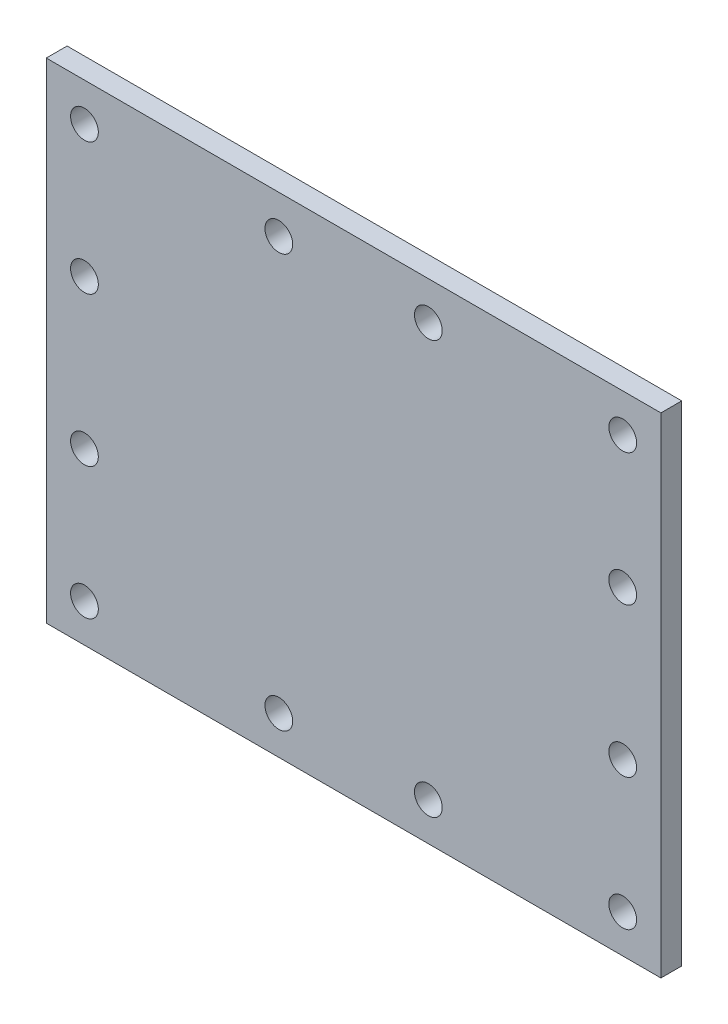
ISO-10303-21;
HEADER;
FILE_DESCRIPTION(('STEP AP214'),'2;1');
FILE_NAME('part.step','',(''),(''),'','','');
FILE_SCHEMA(('AUTOMOTIVE_DESIGN { 1 0 10303 214 1 1 1 1 }'));
ENDSEC;
DATA;
#1=APPLICATION_CONTEXT('core data for automotive mechanical design processes');
#2=APPLICATION_PROTOCOL_DEFINITION('international standard','automotive_design',2000,#1);
#3=PRODUCT_CONTEXT('',#1,'mechanical');
#4=PRODUCT('Part','Part','',(#3));
#5=PRODUCT_RELATED_PRODUCT_CATEGORY('part','',(#4));
#6=PRODUCT_DEFINITION_FORMATION('','',#4);
#7=PRODUCT_DEFINITION_CONTEXT('part definition',#1,'design');
#8=PRODUCT_DEFINITION('design','',#6,#7);
#9=PRODUCT_DEFINITION_SHAPE('','',#8);
#10=(LENGTH_UNIT() NAMED_UNIT(*) SI_UNIT(.MILLI.,.METRE.));
#11=(NAMED_UNIT(*) PLANE_ANGLE_UNIT() SI_UNIT($,.RADIAN.));
#12=(NAMED_UNIT(*) SI_UNIT($,.STERADIAN.) SOLID_ANGLE_UNIT());
#13=UNCERTAINTY_MEASURE_WITH_UNIT(LENGTH_MEASURE(1.E-05),#10,'distance_accuracy_value','');
#14=(GEOMETRIC_REPRESENTATION_CONTEXT(3) GLOBAL_UNCERTAINTY_ASSIGNED_CONTEXT((#13)) GLOBAL_UNIT_ASSIGNED_CONTEXT((#10,
#11,#12)) REPRESENTATION_CONTEXT('',''));
#15=CARTESIAN_POINT('',(0.,0.,0.));
#16=DIRECTION('',(0.,0.,1.));
#17=DIRECTION('',(1.,0.,0.));
#18=AXIS2_PLACEMENT_3D('',#15,#16,#17);
#19=CARTESIAN_POINT('',(-146.164312824647,106.241954424767,-2.51040500289528));
#20=DIRECTION('',(0.,1.,0.));
#21=DIRECTION('',(-1.,0.,0.));
#22=AXIS2_PLACEMENT_3D('',#19,#20,#21);
#23=PLANE('',#22);
#24=DIRECTION('',(1.,0.,0.));
#25=VECTOR('',#24,1.);
#26=CARTESIAN_POINT('',(-146.164312824647,106.241954424767,-5.51040500289528));
#27=LINE('',#26,#25);
#28=CARTESIAN_POINT('',(-146.164312824647,106.241954424767,-5.51040500289528));
#29=VERTEX_POINT('',#28);
#30=CARTESIAN_POINT('',(-57.6243128246472,106.241954424767,-5.51040500289528));
#31=VERTEX_POINT('',#30);
#32=EDGE_CURVE('E98',#29,#31,#27,.T.);
#33=ORIENTED_EDGE('',*,*,#32,.F.);
#34=DIRECTION('',(0.,0.,-1.));
#35=VECTOR('',#34,1.);
#36=CARTESIAN_POINT('',(-146.164312824647,106.241954424767,-2.51040500289528));
#37=LINE('',#36,#35);
#38=CARTESIAN_POINT('',(-146.164312824647,106.241954424767,-2.51040500289528));
#39=VERTEX_POINT('',#38);
#40=EDGE_CURVE('E11',#39,#29,#37,.T.);
#41=ORIENTED_EDGE('',*,*,#40,.F.);
#42=DIRECTION('',(1.,0.,0.));
#43=VECTOR('',#42,1.);
#44=CARTESIAN_POINT('',(-146.164312824647,106.241954424767,-2.51040500289528));
#45=LINE('',#44,#43);
#46=CARTESIAN_POINT('',(-57.6243128246472,106.241954424767,-2.51040500289528));
#47=VERTEX_POINT('',#46);
#48=EDGE_CURVE('E91',#39,#47,#45,.T.);
#49=ORIENTED_EDGE('',*,*,#48,.T.);
#50=DIRECTION('',(0.,0.,-1.));
#51=VECTOR('',#50,1.);
#52=CARTESIAN_POINT('',(-57.6243128246472,106.241954424767,-2.51040500289528));
#53=LINE('',#52,#51);
#54=EDGE_CURVE('E36',#47,#31,#53,.T.);
#55=ORIENTED_EDGE('',*,*,#54,.T.);
#56=EDGE_LOOP('',(#33,#41,#49,#55));
#57=FACE_BOUND('',#56,.T.);
#58=ADVANCED_FACE('F33',(#57),#23,.T.);
#59=CARTESIAN_POINT('',(-146.164312824647,35.7443544247679,-2.51040500289528));
#60=DIRECTION('',(-1.,0.,0.));
#61=DIRECTION('',(0.,0.,1.));
#62=AXIS2_PLACEMENT_3D('',#59,#60,#61);
#63=PLANE('',#62);
#64=DIRECTION('',(0.,1.,0.));
#65=VECTOR('',#64,1.);
#66=CARTESIAN_POINT('',(-146.164312824647,35.7443544247679,-5.51040500289528));
#67=LINE('',#66,#65);
#68=CARTESIAN_POINT('',(-146.164312824647,35.7443544247679,-5.51040500289528));
#69=VERTEX_POINT('',#68);
#70=EDGE_CURVE('E93',#69,#29,#67,.T.);
#71=ORIENTED_EDGE('',*,*,#70,.F.);
#72=DIRECTION('',(0.,0.,-1.));
#73=VECTOR('',#72,1.);
#74=CARTESIAN_POINT('',(-146.164312824647,35.7443544247679,-2.51040500289528));
#75=LINE('',#74,#73);
#76=CARTESIAN_POINT('',(-146.164312824647,35.7443544247679,-2.51040500289528));
#77=VERTEX_POINT('',#76);
#78=EDGE_CURVE('E42',#77,#69,#75,.T.);
#79=ORIENTED_EDGE('',*,*,#78,.F.);
#80=DIRECTION('',(0.,1.,0.));
#81=VECTOR('',#80,1.);
#82=CARTESIAN_POINT('',(-146.164312824647,35.7443544247679,-2.51040500289528));
#83=LINE('',#82,#81);
#84=EDGE_CURVE('E88',#77,#39,#83,.T.);
#85=ORIENTED_EDGE('',*,*,#84,.T.);
#86=ORIENTED_EDGE('',*,*,#40,.T.);
#87=EDGE_LOOP('',(#71,#79,#85,#86));
#88=FACE_BOUND('',#87,.T.);
#89=ADVANCED_FACE('F109',(#88),#63,.T.);
#90=CARTESIAN_POINT('',(-57.6243128246472,35.7443544247679,-2.51040500289528));
#91=DIRECTION('',(0.,-1.,0.));
#92=DIRECTION('',(1.,0.,0.));
#93=AXIS2_PLACEMENT_3D('',#90,#91,#92);
#94=PLANE('',#93);
#95=DIRECTION('',(-1.,0.,0.));
#96=VECTOR('',#95,1.);
#97=CARTESIAN_POINT('',(-57.6243128246472,35.7443544247679,-5.51040500289528));
#98=LINE('',#97,#96);
#99=CARTESIAN_POINT('',(-57.6243128246472,35.7443544247679,-5.51040500289528));
#100=VERTEX_POINT('',#99);
#101=EDGE_CURVE('E83',#100,#69,#98,.T.);
#102=ORIENTED_EDGE('',*,*,#101,.F.);
#103=DIRECTION('',(0.,0.,-1.));
#104=VECTOR('',#103,1.);
#105=CARTESIAN_POINT('',(-57.6243128246472,35.7443544247679,-2.51040500289528));
#106=LINE('',#105,#104);
#107=CARTESIAN_POINT('',(-57.6243128246472,35.7443544247679,-2.51040500289528));
#108=VERTEX_POINT('',#107);
#109=EDGE_CURVE('E78',#108,#100,#106,.T.);
#110=ORIENTED_EDGE('',*,*,#109,.F.);
#111=DIRECTION('',(-1.,0.,0.));
#112=VECTOR('',#111,1.);
#113=CARTESIAN_POINT('',(-57.6243128246472,35.7443544247679,-2.51040500289528));
#114=LINE('',#113,#112);
#115=EDGE_CURVE('E81',#108,#77,#114,.T.);
#116=ORIENTED_EDGE('',*,*,#115,.T.);
#117=ORIENTED_EDGE('',*,*,#78,.T.);
#118=EDGE_LOOP('',(#102,#110,#116,#117));
#119=FACE_BOUND('',#118,.T.);
#120=ADVANCED_FACE('F80',(#119),#94,.T.);
#121=CARTESIAN_POINT('',(-57.6243128246472,106.241954424767,-2.51040500289528));
#122=DIRECTION('',(1.,0.,0.));
#123=DIRECTION('',(0.,1.,0.));
#124=AXIS2_PLACEMENT_3D('',#121,#122,#123);
#125=PLANE('',#124);
#126=DIRECTION('',(0.,-1.,0.));
#127=VECTOR('',#126,1.);
#128=CARTESIAN_POINT('',(-57.6243128246472,106.241954424767,-5.51040500289528));
#129=LINE('',#128,#127);
#130=EDGE_CURVE('E101',#31,#100,#129,.T.);
#131=ORIENTED_EDGE('',*,*,#130,.F.);
#132=ORIENTED_EDGE('',*,*,#54,.F.);
#133=DIRECTION('',(0.,-1.,0.));
#134=VECTOR('',#133,1.);
#135=CARTESIAN_POINT('',(-57.6243128246472,106.241954424767,-2.51040500289528));
#136=LINE('',#135,#134);
#137=EDGE_CURVE('E87',#47,#108,#136,.T.);
#138=ORIENTED_EDGE('',*,*,#137,.T.);
#139=ORIENTED_EDGE('',*,*,#109,.T.);
#140=EDGE_LOOP('',(#131,#132,#138,#139));
#141=FACE_BOUND('',#140,.T.);
#142=ADVANCED_FACE('F90',(#141),#125,.T.);
#143=CARTESIAN_POINT('',(0.,0.,-2.51040500289528));
#144=DIRECTION('',(0.,0.,-1.));
#145=DIRECTION('',(-1.,0.,0.));
#146=AXIS2_PLACEMENT_3D('',#143,#144,#145);
#147=PLANE('',#146);
#148=CARTESIAN_POINT('',(-112.664312824647,100.741954424767,-2.51040500289528));
#149=DIRECTION('',(0.,0.,-1.));
#150=DIRECTION('',(-1.,0.,0.));
#151=AXIS2_PLACEMENT_3D('',#148,#149,#150);
#152=CIRCLE('',#151,2.);
#153=CARTESIAN_POINT('',(-114.664312824647,100.741954424767,-2.51040500289528));
#154=VERTEX_POINT('',#153);
#155=EDGE_CURVE('E182',#154,#154,#152,.T.);
#156=ORIENTED_EDGE('',*,*,#155,.T.);
#157=EDGE_LOOP('',(#156));
#158=FACE_BOUND('',#157,.T.);
#159=CARTESIAN_POINT('',(-91.1243128246472,100.741954424767,-2.51040500289528));
#160=DIRECTION('',(0.,0.,-1.));
#161=DIRECTION('',(-1.,0.,0.));
#162=AXIS2_PLACEMENT_3D('',#159,#160,#161);
#163=CIRCLE('',#162,2.);
#164=CARTESIAN_POINT('',(-93.1243128246472,100.741954424767,-2.51040500289528));
#165=VERTEX_POINT('',#164);
#166=EDGE_CURVE('E190',#165,#165,#163,.T.);
#167=ORIENTED_EDGE('',*,*,#166,.T.);
#168=EDGE_LOOP('',(#167));
#169=FACE_BOUND('',#168,.T.);
#170=CARTESIAN_POINT('',(-63.1243128246472,100.741954424767,-2.51040500289528));
#171=DIRECTION('',(0.,0.,-1.));
#172=DIRECTION('',(-1.,0.,0.));
#173=AXIS2_PLACEMENT_3D('',#170,#171,#172);
#174=CIRCLE('',#173,1.99999999999998);
#175=CARTESIAN_POINT('',(-65.1243128246472,100.741954424767,-2.51040500289528));
#176=VERTEX_POINT('',#175);
#177=EDGE_CURVE('E196',#176,#176,#174,.T.);
#178=ORIENTED_EDGE('',*,*,#177,.T.);
#179=EDGE_LOOP('',(#178));
#180=FACE_BOUND('',#179,.T.);
#181=CARTESIAN_POINT('',(-63.1243128246471,81.7419544247674,-2.51040500289528));
#182=DIRECTION('',(0.,0.,-1.));
#183=DIRECTION('',(-1.,0.,0.));
#184=AXIS2_PLACEMENT_3D('',#181,#182,#183);
#185=CIRCLE('',#184,1.99999999999998);
#186=CARTESIAN_POINT('',(-65.1243128246471,81.7419544247674,-2.51040500289528));
#187=VERTEX_POINT('',#186);
#188=EDGE_CURVE('E202',#187,#187,#185,.T.);
#189=ORIENTED_EDGE('',*,*,#188,.T.);
#190=EDGE_LOOP('',(#189));
#191=FACE_BOUND('',#190,.T.);
#192=CARTESIAN_POINT('',(-63.1243128246471,60.2443544247679,-2.51040500289528));
#193=DIRECTION('',(0.,0.,-1.));
#194=DIRECTION('',(-1.,0.,0.));
#195=AXIS2_PLACEMENT_3D('',#192,#193,#194);
#196=CIRCLE('',#195,1.99999999999998);
#197=CARTESIAN_POINT('',(-65.1243128246471,60.2443544247679,-2.51040500289528));
#198=VERTEX_POINT('',#197);
#199=EDGE_CURVE('E208',#198,#198,#196,.T.);
#200=ORIENTED_EDGE('',*,*,#199,.T.);
#201=EDGE_LOOP('',(#200));
#202=FACE_BOUND('',#201,.T.);
#203=CARTESIAN_POINT('',(-63.1243128246472,41.2443544247679,-2.51040500289528));
#204=DIRECTION('',(0.,0.,-1.));
#205=DIRECTION('',(-1.,0.,0.));
#206=AXIS2_PLACEMENT_3D('',#203,#204,#205);
#207=CIRCLE('',#206,1.99999999999998);
#208=CARTESIAN_POINT('',(-65.1243128246472,41.2443544247679,-2.51040500289528));
#209=VERTEX_POINT('',#208);
#210=EDGE_CURVE('E214',#209,#209,#207,.T.);
#211=ORIENTED_EDGE('',*,*,#210,.T.);
#212=EDGE_LOOP('',(#211));
#213=FACE_BOUND('',#212,.T.);
#214=CARTESIAN_POINT('',(-91.1243128246472,41.2443544247679,-2.51040500289528));
#215=DIRECTION('',(0.,0.,-1.));
#216=DIRECTION('',(-1.,0.,0.));
#217=AXIS2_PLACEMENT_3D('',#214,#215,#216);
#218=CIRCLE('',#217,2.);
#219=CARTESIAN_POINT('',(-93.1243128246472,41.2443544247679,-2.51040500289528));
#220=VERTEX_POINT('',#219);
#221=EDGE_CURVE('E220',#220,#220,#218,.T.);
#222=ORIENTED_EDGE('',*,*,#221,.T.);
#223=EDGE_LOOP('',(#222));
#224=FACE_BOUND('',#223,.T.);
#225=CARTESIAN_POINT('',(-112.664312824647,41.2443544247679,-2.51040500289528));
#226=DIRECTION('',(0.,0.,-1.));
#227=DIRECTION('',(-1.,0.,0.));
#228=AXIS2_PLACEMENT_3D('',#225,#226,#227);
#229=CIRCLE('',#228,2.);
#230=CARTESIAN_POINT('',(-114.664312824647,41.2443544247679,-2.51040500289528));
#231=VERTEX_POINT('',#230);
#232=EDGE_CURVE('E226',#231,#231,#229,.T.);
#233=ORIENTED_EDGE('',*,*,#232,.T.);
#234=EDGE_LOOP('',(#233));
#235=FACE_BOUND('',#234,.T.);
#236=CARTESIAN_POINT('',(-140.664312824647,41.2443544247679,-2.51040500289528));
#237=DIRECTION('',(0.,0.,-1.));
#238=DIRECTION('',(-1.,0.,0.));
#239=AXIS2_PLACEMENT_3D('',#236,#237,#238);
#240=CIRCLE('',#239,2.);
#241=CARTESIAN_POINT('',(-142.664312824647,41.2443544247679,-2.51040500289528));
#242=VERTEX_POINT('',#241);
#243=EDGE_CURVE('E232',#242,#242,#240,.T.);
#244=ORIENTED_EDGE('',*,*,#243,.T.);
#245=EDGE_LOOP('',(#244));
#246=FACE_BOUND('',#245,.T.);
#247=CARTESIAN_POINT('',(-140.664312824647,60.2443544247679,-2.51040500289528));
#248=DIRECTION('',(0.,0.,-1.));
#249=DIRECTION('',(-1.,0.,0.));
#250=AXIS2_PLACEMENT_3D('',#247,#248,#249);
#251=CIRCLE('',#250,2.);
#252=CARTESIAN_POINT('',(-142.664312824647,60.2443544247679,-2.51040500289528));
#253=VERTEX_POINT('',#252);
#254=EDGE_CURVE('E238',#253,#253,#251,.T.);
#255=ORIENTED_EDGE('',*,*,#254,.T.);
#256=EDGE_LOOP('',(#255));
#257=FACE_BOUND('',#256,.T.);
#258=CARTESIAN_POINT('',(-140.664312824647,100.741954424767,-2.51040500289528));
#259=DIRECTION('',(0.,0.,-1.));
#260=DIRECTION('',(-1.,0.,0.));
#261=AXIS2_PLACEMENT_3D('',#258,#259,#260);
#262=CIRCLE('',#261,2.);
#263=CARTESIAN_POINT('',(-142.664312824647,100.741954424767,-2.51040500289528));
#264=VERTEX_POINT('',#263);
#265=EDGE_CURVE('E244',#264,#264,#262,.T.);
#266=ORIENTED_EDGE('',*,*,#265,.T.);
#267=EDGE_LOOP('',(#266));
#268=FACE_BOUND('',#267,.T.);
#269=CARTESIAN_POINT('',(-140.664312824647,81.7419544247674,-2.51040500289528));
#270=DIRECTION('',(0.,0.,-1.));
#271=DIRECTION('',(-1.,0.,0.));
#272=AXIS2_PLACEMENT_3D('',#269,#270,#271);
#273=CIRCLE('',#272,2.);
#274=CARTESIAN_POINT('',(-142.664312824647,81.7419544247674,-2.51040500289528));
#275=VERTEX_POINT('',#274);
#276=EDGE_CURVE('E102',#275,#275,#273,.T.);
#277=ORIENTED_EDGE('',*,*,#276,.T.);
#278=EDGE_LOOP('',(#277));
#279=FACE_BOUND('',#278,.T.);
#280=ORIENTED_EDGE('',*,*,#48,.F.);
#281=ORIENTED_EDGE('',*,*,#84,.F.);
#282=ORIENTED_EDGE('',*,*,#115,.F.);
#283=ORIENTED_EDGE('',*,*,#137,.F.);
#284=EDGE_LOOP('',(#280,#281,#282,#283));
#285=FACE_BOUND('',#284,.T.);
#286=ADVANCED_FACE('F86',(#158,#169,#180,#191,#202,#213,#224,#235,#246,#257,#268,#279,#285),
#147,.F.);
#287=CARTESIAN_POINT('',(0.,0.,-5.51040500289528));
#288=DIRECTION('',(0.,0.,-1.));
#289=DIRECTION('',(-1.,0.,0.));
#290=AXIS2_PLACEMENT_3D('',#287,#288,#289);
#291=PLANE('',#290);
#292=CARTESIAN_POINT('',(-112.664312824647,100.741954424767,-5.51040500289528));
#293=DIRECTION('',(0.,0.,-1.));
#294=DIRECTION('',(-1.,0.,0.));
#295=AXIS2_PLACEMENT_3D('',#292,#293,#294);
#296=CIRCLE('',#295,2.);
#297=CARTESIAN_POINT('',(-114.664312824647,100.741954424767,-5.51040500289528));
#298=VERTEX_POINT('',#297);
#299=EDGE_CURVE('E185',#298,#298,#296,.T.);
#300=ORIENTED_EDGE('',*,*,#299,.F.);
#301=EDGE_LOOP('',(#300));
#302=FACE_BOUND('',#301,.T.);
#303=CARTESIAN_POINT('',(-91.1243128246472,100.741954424767,-5.51040500289528));
#304=DIRECTION('',(0.,0.,-1.));
#305=DIRECTION('',(-1.,0.,0.));
#306=AXIS2_PLACEMENT_3D('',#303,#304,#305);
#307=CIRCLE('',#306,2.);
#308=CARTESIAN_POINT('',(-93.1243128246472,100.741954424767,-5.51040500289528));
#309=VERTEX_POINT('',#308);
#310=EDGE_CURVE('E187',#309,#309,#307,.T.);
#311=ORIENTED_EDGE('',*,*,#310,.F.);
#312=EDGE_LOOP('',(#311));
#313=FACE_BOUND('',#312,.T.);
#314=CARTESIAN_POINT('',(-63.1243128246472,100.741954424767,-5.51040500289528));
#315=DIRECTION('',(0.,0.,-1.));
#316=DIRECTION('',(-1.,0.,0.));
#317=AXIS2_PLACEMENT_3D('',#314,#315,#316);
#318=CIRCLE('',#317,1.99999999999998);
#319=CARTESIAN_POINT('',(-65.1243128246472,100.741954424767,-5.51040500289528));
#320=VERTEX_POINT('',#319);
#321=EDGE_CURVE('E193',#320,#320,#318,.T.);
#322=ORIENTED_EDGE('',*,*,#321,.F.);
#323=EDGE_LOOP('',(#322));
#324=FACE_BOUND('',#323,.T.);
#325=CARTESIAN_POINT('',(-63.1243128246471,81.7419544247674,-5.51040500289528));
#326=DIRECTION('',(0.,0.,-1.));
#327=DIRECTION('',(-1.,0.,0.));
#328=AXIS2_PLACEMENT_3D('',#325,#326,#327);
#329=CIRCLE('',#328,1.99999999999998);
#330=CARTESIAN_POINT('',(-65.1243128246471,81.7419544247674,-5.51040500289528));
#331=VERTEX_POINT('',#330);
#332=EDGE_CURVE('E199',#331,#331,#329,.T.);
#333=ORIENTED_EDGE('',*,*,#332,.F.);
#334=EDGE_LOOP('',(#333));
#335=FACE_BOUND('',#334,.T.);
#336=CARTESIAN_POINT('',(-63.1243128246471,60.2443544247679,-5.51040500289528));
#337=DIRECTION('',(0.,0.,-1.));
#338=DIRECTION('',(-1.,0.,0.));
#339=AXIS2_PLACEMENT_3D('',#336,#337,#338);
#340=CIRCLE('',#339,1.99999999999998);
#341=CARTESIAN_POINT('',(-65.1243128246471,60.2443544247679,-5.51040500289528));
#342=VERTEX_POINT('',#341);
#343=EDGE_CURVE('E205',#342,#342,#340,.T.);
#344=ORIENTED_EDGE('',*,*,#343,.F.);
#345=EDGE_LOOP('',(#344));
#346=FACE_BOUND('',#345,.T.);
#347=CARTESIAN_POINT('',(-63.1243128246472,41.2443544247679,-5.51040500289528));
#348=DIRECTION('',(0.,0.,-1.));
#349=DIRECTION('',(-1.,0.,0.));
#350=AXIS2_PLACEMENT_3D('',#347,#348,#349);
#351=CIRCLE('',#350,1.99999999999998);
#352=CARTESIAN_POINT('',(-65.1243128246472,41.2443544247679,-5.51040500289528));
#353=VERTEX_POINT('',#352);
#354=EDGE_CURVE('E211',#353,#353,#351,.T.);
#355=ORIENTED_EDGE('',*,*,#354,.F.);
#356=EDGE_LOOP('',(#355));
#357=FACE_BOUND('',#356,.T.);
#358=CARTESIAN_POINT('',(-91.1243128246472,41.2443544247679,-5.51040500289528));
#359=DIRECTION('',(0.,0.,-1.));
#360=DIRECTION('',(-1.,0.,0.));
#361=AXIS2_PLACEMENT_3D('',#358,#359,#360);
#362=CIRCLE('',#361,2.);
#363=CARTESIAN_POINT('',(-93.1243128246472,41.2443544247679,-5.51040500289528));
#364=VERTEX_POINT('',#363);
#365=EDGE_CURVE('E217',#364,#364,#362,.T.);
#366=ORIENTED_EDGE('',*,*,#365,.F.);
#367=EDGE_LOOP('',(#366));
#368=FACE_BOUND('',#367,.T.);
#369=CARTESIAN_POINT('',(-112.664312824647,41.2443544247679,-5.51040500289528));
#370=DIRECTION('',(0.,0.,-1.));
#371=DIRECTION('',(-1.,0.,0.));
#372=AXIS2_PLACEMENT_3D('',#369,#370,#371);
#373=CIRCLE('',#372,2.);
#374=CARTESIAN_POINT('',(-114.664312824647,41.2443544247679,-5.51040500289528));
#375=VERTEX_POINT('',#374);
#376=EDGE_CURVE('E223',#375,#375,#373,.T.);
#377=ORIENTED_EDGE('',*,*,#376,.F.);
#378=EDGE_LOOP('',(#377));
#379=FACE_BOUND('',#378,.T.);
#380=CARTESIAN_POINT('',(-140.664312824647,41.2443544247679,-5.51040500289528));
#381=DIRECTION('',(0.,0.,-1.));
#382=DIRECTION('',(-1.,0.,0.));
#383=AXIS2_PLACEMENT_3D('',#380,#381,#382);
#384=CIRCLE('',#383,2.);
#385=CARTESIAN_POINT('',(-142.664312824647,41.2443544247679,-5.51040500289528));
#386=VERTEX_POINT('',#385);
#387=EDGE_CURVE('E229',#386,#386,#384,.T.);
#388=ORIENTED_EDGE('',*,*,#387,.F.);
#389=EDGE_LOOP('',(#388));
#390=FACE_BOUND('',#389,.T.);
#391=CARTESIAN_POINT('',(-140.664312824647,60.2443544247679,-5.51040500289528));
#392=DIRECTION('',(0.,0.,-1.));
#393=DIRECTION('',(-1.,0.,0.));
#394=AXIS2_PLACEMENT_3D('',#391,#392,#393);
#395=CIRCLE('',#394,2.);
#396=CARTESIAN_POINT('',(-142.664312824647,60.2443544247679,-5.51040500289528));
#397=VERTEX_POINT('',#396);
#398=EDGE_CURVE('E235',#397,#397,#395,.T.);
#399=ORIENTED_EDGE('',*,*,#398,.F.);
#400=EDGE_LOOP('',(#399));
#401=FACE_BOUND('',#400,.T.);
#402=CARTESIAN_POINT('',(-140.664312824647,100.741954424767,-5.51040500289528));
#403=DIRECTION('',(0.,0.,-1.));
#404=DIRECTION('',(-1.,0.,0.));
#405=AXIS2_PLACEMENT_3D('',#402,#403,#404);
#406=CIRCLE('',#405,2.);
#407=CARTESIAN_POINT('',(-142.664312824647,100.741954424767,-5.51040500289528));
#408=VERTEX_POINT('',#407);
#409=EDGE_CURVE('E241',#408,#408,#406,.T.);
#410=ORIENTED_EDGE('',*,*,#409,.F.);
#411=EDGE_LOOP('',(#410));
#412=FACE_BOUND('',#411,.T.);
#413=CARTESIAN_POINT('',(-140.664312824647,81.7419544247674,-5.51040500289528));
#414=DIRECTION('',(0.,0.,-1.));
#415=DIRECTION('',(-1.,0.,0.));
#416=AXIS2_PLACEMENT_3D('',#413,#414,#415);
#417=CIRCLE('',#416,2.);
#418=CARTESIAN_POINT('',(-142.664312824647,81.7419544247674,-5.51040500289528));
#419=VERTEX_POINT('',#418);
#420=EDGE_CURVE('E247',#419,#419,#417,.T.);
#421=ORIENTED_EDGE('',*,*,#420,.F.);
#422=EDGE_LOOP('',(#421));
#423=FACE_BOUND('',#422,.T.);
#424=ORIENTED_EDGE('',*,*,#32,.T.);
#425=ORIENTED_EDGE('',*,*,#130,.T.);
#426=ORIENTED_EDGE('',*,*,#101,.T.);
#427=ORIENTED_EDGE('',*,*,#70,.T.);
#428=EDGE_LOOP('',(#424,#425,#426,#427));
#429=FACE_BOUND('',#428,.T.);
#430=ADVANCED_FACE('F108',(#302,#313,#324,#335,#346,#357,#368,#379,#390,#401,#412,#423,#429),
#291,.T.);
#431=CARTESIAN_POINT('',(-140.664312824647,81.7419544247674,-2.51040500289528));
#432=DIRECTION('',(0.,0.,-1.));
#433=DIRECTION('',(-1.,0.,0.));
#434=AXIS2_PLACEMENT_3D('',#431,#432,#433);
#435=CYLINDRICAL_SURFACE('',#434,2.);
#436=ORIENTED_EDGE('',*,*,#276,.F.);
#437=EDGE_LOOP('',(#436));
#438=FACE_BOUND('',#437,.T.);
#439=ORIENTED_EDGE('',*,*,#420,.T.);
#440=EDGE_LOOP('',(#439));
#441=FACE_BOUND('',#440,.T.);
#442=ADVANCED_FACE('F127',(#438,#441),#435,.F.);
#443=CARTESIAN_POINT('',(-140.664312824647,100.741954424767,-2.51040500289528));
#444=DIRECTION('',(0.,0.,-1.));
#445=DIRECTION('',(-1.,0.,0.));
#446=AXIS2_PLACEMENT_3D('',#443,#444,#445);
#447=CYLINDRICAL_SURFACE('',#446,2.);
#448=ORIENTED_EDGE('',*,*,#265,.F.);
#449=EDGE_LOOP('',(#448));
#450=FACE_BOUND('',#449,.T.);
#451=ORIENTED_EDGE('',*,*,#409,.T.);
#452=EDGE_LOOP('',(#451));
#453=FACE_BOUND('',#452,.T.);
#454=ADVANCED_FACE('F134',(#450,#453),#447,.F.);
#455=CARTESIAN_POINT('',(-140.664312824647,60.2443544247679,-2.51040500289528));
#456=DIRECTION('',(0.,0.,-1.));
#457=DIRECTION('',(-1.,0.,0.));
#458=AXIS2_PLACEMENT_3D('',#455,#456,#457);
#459=CYLINDRICAL_SURFACE('',#458,2.);
#460=ORIENTED_EDGE('',*,*,#254,.F.);
#461=EDGE_LOOP('',(#460));
#462=FACE_BOUND('',#461,.T.);
#463=ORIENTED_EDGE('',*,*,#398,.T.);
#464=EDGE_LOOP('',(#463));
#465=FACE_BOUND('',#464,.T.);
#466=ADVANCED_FACE('F138',(#462,#465),#459,.F.);
#467=CARTESIAN_POINT('',(-140.664312824647,41.2443544247679,-2.51040500289528));
#468=DIRECTION('',(0.,0.,-1.));
#469=DIRECTION('',(-1.,0.,0.));
#470=AXIS2_PLACEMENT_3D('',#467,#468,#469);
#471=CYLINDRICAL_SURFACE('',#470,2.);
#472=ORIENTED_EDGE('',*,*,#243,.F.);
#473=EDGE_LOOP('',(#472));
#474=FACE_BOUND('',#473,.T.);
#475=ORIENTED_EDGE('',*,*,#387,.T.);
#476=EDGE_LOOP('',(#475));
#477=FACE_BOUND('',#476,.T.);
#478=ADVANCED_FACE('F142',(#474,#477),#471,.F.);
#479=CARTESIAN_POINT('',(-112.664312824647,41.2443544247679,-2.51040500289528));
#480=DIRECTION('',(0.,0.,-1.));
#481=DIRECTION('',(-1.,0.,0.));
#482=AXIS2_PLACEMENT_3D('',#479,#480,#481);
#483=CYLINDRICAL_SURFACE('',#482,2.);
#484=ORIENTED_EDGE('',*,*,#232,.F.);
#485=EDGE_LOOP('',(#484));
#486=FACE_BOUND('',#485,.T.);
#487=ORIENTED_EDGE('',*,*,#376,.T.);
#488=EDGE_LOOP('',(#487));
#489=FACE_BOUND('',#488,.T.);
#490=ADVANCED_FACE('F146',(#486,#489),#483,.F.);
#491=CARTESIAN_POINT('',(-91.1243128246472,41.2443544247679,-2.51040500289528));
#492=DIRECTION('',(0.,0.,-1.));
#493=DIRECTION('',(-1.,0.,0.));
#494=AXIS2_PLACEMENT_3D('',#491,#492,#493);
#495=CYLINDRICAL_SURFACE('',#494,2.);
#496=ORIENTED_EDGE('',*,*,#221,.F.);
#497=EDGE_LOOP('',(#496));
#498=FACE_BOUND('',#497,.T.);
#499=ORIENTED_EDGE('',*,*,#365,.T.);
#500=EDGE_LOOP('',(#499));
#501=FACE_BOUND('',#500,.T.);
#502=ADVANCED_FACE('F150',(#498,#501),#495,.F.);
#503=CARTESIAN_POINT('',(-63.1243128246472,41.2443544247679,-2.51040500289528));
#504=DIRECTION('',(0.,0.,-1.));
#505=DIRECTION('',(-1.,0.,0.));
#506=AXIS2_PLACEMENT_3D('',#503,#504,#505);
#507=CYLINDRICAL_SURFACE('',#506,1.99999999999998);
#508=ORIENTED_EDGE('',*,*,#210,.F.);
#509=EDGE_LOOP('',(#508));
#510=FACE_BOUND('',#509,.T.);
#511=ORIENTED_EDGE('',*,*,#354,.T.);
#512=EDGE_LOOP('',(#511));
#513=FACE_BOUND('',#512,.T.);
#514=ADVANCED_FACE('F154',(#510,#513),#507,.F.);
#515=CARTESIAN_POINT('',(-63.1243128246471,60.2443544247679,-2.51040500289528));
#516=DIRECTION('',(0.,0.,-1.));
#517=DIRECTION('',(-1.,0.,0.));
#518=AXIS2_PLACEMENT_3D('',#515,#516,#517);
#519=CYLINDRICAL_SURFACE('',#518,1.99999999999998);
#520=ORIENTED_EDGE('',*,*,#199,.F.);
#521=EDGE_LOOP('',(#520));
#522=FACE_BOUND('',#521,.T.);
#523=ORIENTED_EDGE('',*,*,#343,.T.);
#524=EDGE_LOOP('',(#523));
#525=FACE_BOUND('',#524,.T.);
#526=ADVANCED_FACE('F158',(#522,#525),#519,.F.);
#527=CARTESIAN_POINT('',(-63.1243128246471,81.7419544247674,-2.51040500289528));
#528=DIRECTION('',(0.,0.,-1.));
#529=DIRECTION('',(-1.,0.,0.));
#530=AXIS2_PLACEMENT_3D('',#527,#528,#529);
#531=CYLINDRICAL_SURFACE('',#530,1.99999999999998);
#532=ORIENTED_EDGE('',*,*,#188,.F.);
#533=EDGE_LOOP('',(#532));
#534=FACE_BOUND('',#533,.T.);
#535=ORIENTED_EDGE('',*,*,#332,.T.);
#536=EDGE_LOOP('',(#535));
#537=FACE_BOUND('',#536,.T.);
#538=ADVANCED_FACE('F162',(#534,#537),#531,.F.);
#539=CARTESIAN_POINT('',(-63.1243128246472,100.741954424767,-2.51040500289528));
#540=DIRECTION('',(0.,0.,-1.));
#541=DIRECTION('',(-1.,0.,0.));
#542=AXIS2_PLACEMENT_3D('',#539,#540,#541);
#543=CYLINDRICAL_SURFACE('',#542,1.99999999999998);
#544=ORIENTED_EDGE('',*,*,#177,.F.);
#545=EDGE_LOOP('',(#544));
#546=FACE_BOUND('',#545,.T.);
#547=ORIENTED_EDGE('',*,*,#321,.T.);
#548=EDGE_LOOP('',(#547));
#549=FACE_BOUND('',#548,.T.);
#550=ADVANCED_FACE('F166',(#546,#549),#543,.F.);
#551=CARTESIAN_POINT('',(-91.1243128246472,100.741954424767,-2.51040500289528));
#552=DIRECTION('',(0.,0.,-1.));
#553=DIRECTION('',(-1.,0.,0.));
#554=AXIS2_PLACEMENT_3D('',#551,#552,#553);
#555=CYLINDRICAL_SURFACE('',#554,2.);
#556=ORIENTED_EDGE('',*,*,#166,.F.);
#557=EDGE_LOOP('',(#556));
#558=FACE_BOUND('',#557,.T.);
#559=ORIENTED_EDGE('',*,*,#310,.T.);
#560=EDGE_LOOP('',(#559));
#561=FACE_BOUND('',#560,.T.);
#562=ADVANCED_FACE('F170',(#558,#561),#555,.F.);
#563=CARTESIAN_POINT('',(-112.664312824647,100.741954424767,-2.51040500289528));
#564=DIRECTION('',(0.,0.,-1.));
#565=DIRECTION('',(-1.,0.,0.));
#566=AXIS2_PLACEMENT_3D('',#563,#564,#565);
#567=CYLINDRICAL_SURFACE('',#566,2.);
#568=ORIENTED_EDGE('',*,*,#155,.F.);
#569=EDGE_LOOP('',(#568));
#570=FACE_BOUND('',#569,.T.);
#571=ORIENTED_EDGE('',*,*,#299,.T.);
#572=EDGE_LOOP('',(#571));
#573=FACE_BOUND('',#572,.T.);
#574=ADVANCED_FACE('F174',(#570,#573),#567,.F.);
#575=CLOSED_SHELL('',(#58,#89,#120,#142,#286,#430,#442,#454,#466,#478,#490,#502,#514,#526,#538,
#550,#562,#574));
#576=MANIFOLD_SOLID_BREP('B2',#575);
#577=ADVANCED_BREP_SHAPE_REPRESENTATION('',(#18,#576),#14);
#578=SHAPE_DEFINITION_REPRESENTATION(#9,#577);
ENDSEC;
END-ISO-10303-21;
